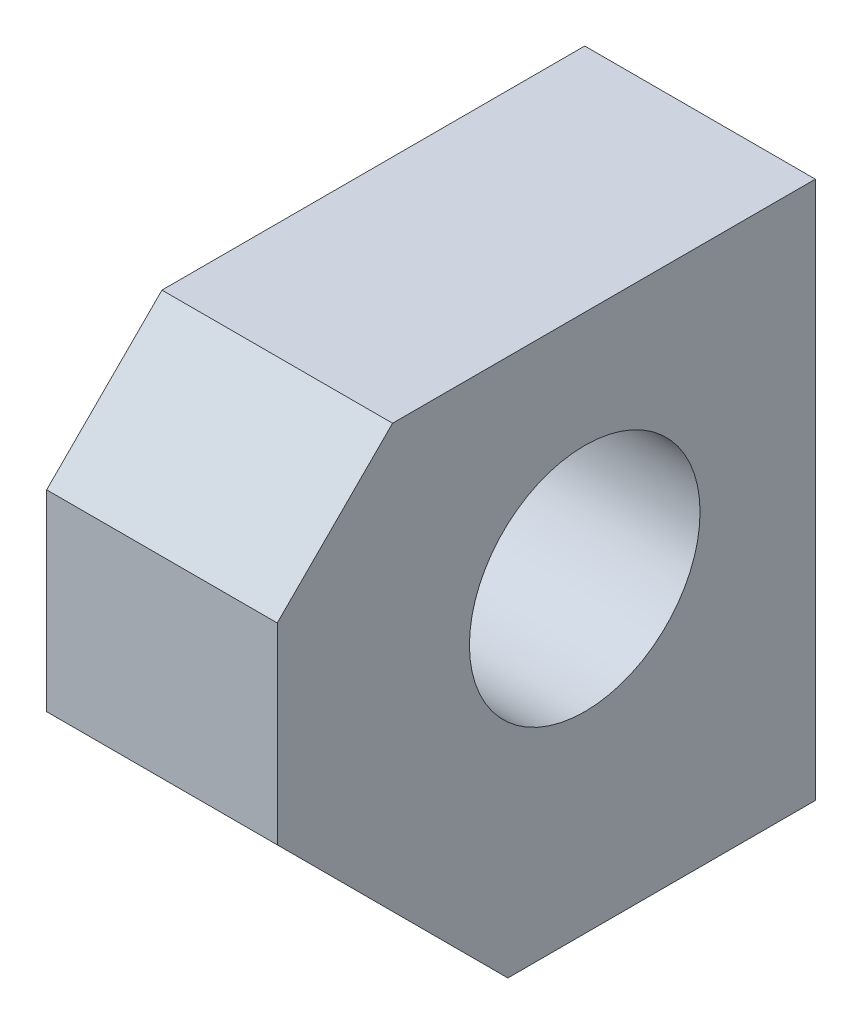
ISO-10303-21;
HEADER;
FILE_DESCRIPTION(('STEP AP214'),'2;1');
FILE_NAME('part.step','',(''),(''),'','','');
FILE_SCHEMA(('AUTOMOTIVE_DESIGN { 1 0 10303 214 1 1 1 1 }'));
ENDSEC;
DATA;
#1=APPLICATION_CONTEXT('core data for automotive mechanical design processes');
#2=APPLICATION_PROTOCOL_DEFINITION('international standard','automotive_design',2000,#1);
#3=PRODUCT_CONTEXT('',#1,'mechanical');
#4=PRODUCT('Part','Part','',(#3));
#5=PRODUCT_RELATED_PRODUCT_CATEGORY('part','',(#4));
#6=PRODUCT_DEFINITION_FORMATION('','',#4);
#7=PRODUCT_DEFINITION_CONTEXT('part definition',#1,'design');
#8=PRODUCT_DEFINITION('design','',#6,#7);
#9=PRODUCT_DEFINITION_SHAPE('','',#8);
#10=(LENGTH_UNIT() NAMED_UNIT(*) SI_UNIT(.MILLI.,.METRE.));
#11=(NAMED_UNIT(*) PLANE_ANGLE_UNIT() SI_UNIT($,.RADIAN.));
#12=(NAMED_UNIT(*) SI_UNIT($,.STERADIAN.) SOLID_ANGLE_UNIT());
#13=UNCERTAINTY_MEASURE_WITH_UNIT(LENGTH_MEASURE(1.E-05),#10,'distance_accuracy_value','');
#14=(GEOMETRIC_REPRESENTATION_CONTEXT(3) GLOBAL_UNCERTAINTY_ASSIGNED_CONTEXT((#13)) GLOBAL_UNIT_ASSIGNED_CONTEXT((#10,
#11,#12)) REPRESENTATION_CONTEXT('',''));
#15=CARTESIAN_POINT('',(0.,0.,0.));
#16=DIRECTION('',(0.,0.,1.));
#17=DIRECTION('',(1.,0.,0.));
#18=AXIS2_PLACEMENT_3D('',#15,#16,#17);
#19=CARTESIAN_POINT('',(-19.05,-412.75,1071.626));
#20=DIRECTION('',(-1.,0.,0.));
#21=DIRECTION('',(0.,0.,1.));
#22=AXIS2_PLACEMENT_3D('',#19,#20,#21);
#23=PLANE('',#22);
#24=CARTESIAN_POINT('',(-19.05,-450.85,1109.726));
#25=DIRECTION('',(1.,0.,0.));
#26=DIRECTION('',(0.,0.,-1.));
#27=AXIS2_PLACEMENT_3D('',#24,#25,#26);
#28=CIRCLE('',#27,19.05);
#29=CARTESIAN_POINT('',(-19.05,-450.85,1090.676));
#30=VERTEX_POINT('',#29);
#31=EDGE_CURVE('E19',#30,#30,#28,.T.);
#32=ORIENTED_EDGE('',*,*,#31,.T.);
#33=EDGE_LOOP('',(#32));
#34=FACE_BOUND('',#33,.T.);
#35=DIRECTION('',(0.,1.,0.));
#36=VECTOR('',#35,1.);
#37=CARTESIAN_POINT('',(-19.05,0.,1160.526));
#38=LINE('',#37,#36);
#39=CARTESIAN_POINT('',(-19.05,-431.8,1160.526));
#40=VERTEX_POINT('',#39);
#41=CARTESIAN_POINT('',(-19.05,-463.55,1160.526));
#42=VERTEX_POINT('',#41);
#43=EDGE_CURVE('E70',#40,#42,#38,.F.);
#44=ORIENTED_EDGE('',*,*,#43,.F.);
#45=DIRECTION('',(0.,-0.707106781186548,0.707106781186548));
#46=VECTOR('',#45,1.);
#47=CARTESIAN_POINT('',(-19.05,-422.275,1151.001));
#48=LINE('',#47,#46);
#49=CARTESIAN_POINT('',(-19.05,-412.75,1141.476));
#50=VERTEX_POINT('',#49);
#51=EDGE_CURVE('E104',#50,#40,#48,.T.);
#52=ORIENTED_EDGE('',*,*,#51,.F.);
#53=DIRECTION('',(0.,0.,1.));
#54=VECTOR('',#53,1.);
#55=CARTESIAN_POINT('',(-19.05,-412.75,1071.626));
#56=LINE('',#55,#54);
#57=CARTESIAN_POINT('',(-19.05,-412.75,1071.626));
#58=VERTEX_POINT('',#57);
#59=EDGE_CURVE('E100',#58,#50,#56,.T.);
#60=ORIENTED_EDGE('',*,*,#59,.F.);
#61=DIRECTION('',(0.,1.,0.));
#62=VECTOR('',#61,1.);
#63=CARTESIAN_POINT('',(-19.05,0.,1071.626));
#64=LINE('',#63,#62);
#65=CARTESIAN_POINT('',(-19.05,-501.65,1071.626));
#66=VERTEX_POINT('',#65);
#67=EDGE_CURVE('E93',#58,#66,#64,.F.);
#68=ORIENTED_EDGE('',*,*,#67,.T.);
#69=DIRECTION('',(0.,0.,-1.));
#70=VECTOR('',#69,1.);
#71=CARTESIAN_POINT('',(-19.05,-501.65,1071.626));
#72=LINE('',#71,#70);
#73=CARTESIAN_POINT('',(-19.05,-501.65,1122.426));
#74=VERTEX_POINT('',#73);
#75=EDGE_CURVE('E65',#74,#66,#72,.T.);
#76=ORIENTED_EDGE('',*,*,#75,.F.);
#77=DIRECTION('',(0.,-0.707106781186548,-0.707106781186548));
#78=VECTOR('',#77,1.);
#79=CARTESIAN_POINT('',(-19.05,-482.6,1141.476));
#80=LINE('',#79,#78);
#81=EDGE_CURVE('E80',#42,#74,#80,.T.);
#82=ORIENTED_EDGE('',*,*,#81,.F.);
#83=EDGE_LOOP('',(#44,#52,#60,#68,#76,#82));
#84=FACE_BOUND('',#83,.T.);
#85=ADVANCED_FACE('F16',(#34,#84),#23,.T.);
#86=CARTESIAN_POINT('',(0.,0.,1160.526));
#87=DIRECTION('',(0.,0.,1.));
#88=DIRECTION('',(1.,0.,0.));
#89=AXIS2_PLACEMENT_3D('',#86,#87,#88);
#90=PLANE('',#89);
#91=DIRECTION('',(0.,1.,0.));
#92=VECTOR('',#91,1.);
#93=CARTESIAN_POINT('',(19.05,-501.65,1160.526));
#94=LINE('',#93,#92);
#95=CARTESIAN_POINT('',(19.05,-431.8,1160.526));
#96=VERTEX_POINT('',#95);
#97=CARTESIAN_POINT('',(19.05,-463.55,1160.526));
#98=VERTEX_POINT('',#97);
#99=EDGE_CURVE('E106',#96,#98,#94,.F.);
#100=ORIENTED_EDGE('',*,*,#99,.F.);
#101=DIRECTION('',(1.,0.,0.));
#102=VECTOR('',#101,1.);
#103=CARTESIAN_POINT('',(0.,-431.8,1160.526));
#104=LINE('',#103,#102);
#105=EDGE_CURVE('E76',#40,#96,#104,.T.);
#106=ORIENTED_EDGE('',*,*,#105,.F.);
#107=ORIENTED_EDGE('',*,*,#43,.T.);
#108=DIRECTION('',(1.,0.,0.));
#109=VECTOR('',#108,1.);
#110=CARTESIAN_POINT('',(0.,-463.55,1160.526));
#111=LINE('',#110,#109);
#112=EDGE_CURVE('E73',#98,#42,#111,.F.);
#113=ORIENTED_EDGE('',*,*,#112,.F.);
#114=EDGE_LOOP('',(#100,#106,#107,#113));
#115=FACE_BOUND('',#114,.T.);
#116=ADVANCED_FACE('F71',(#115),#90,.T.);
#117=CARTESIAN_POINT('',(0.,-482.6,1141.476));
#118=DIRECTION('',(0.,-0.707106781186548,0.707106781186548));
#119=DIRECTION('',(0.,-0.707106781186548,-0.707106781186548));
#120=AXIS2_PLACEMENT_3D('',#117,#118,#119);
#121=PLANE('',#120);
#122=DIRECTION('',(1.,0.,0.));
#123=VECTOR('',#122,1.);
#124=CARTESIAN_POINT('',(-19.05,-501.65,1122.426));
#125=LINE('',#124,#123);
#126=CARTESIAN_POINT('',(19.05,-501.65,1122.426));
#127=VERTEX_POINT('',#126);
#128=EDGE_CURVE('E91',#127,#74,#125,.F.);
#129=ORIENTED_EDGE('',*,*,#128,.F.);
#130=DIRECTION('',(0.,-0.707106781186547,-0.707106781186548));
#131=VECTOR('',#130,1.);
#132=CARTESIAN_POINT('',(19.05,-463.55,1160.526));
#133=LINE('',#132,#131);
#134=EDGE_CURVE('E86',#98,#127,#133,.T.);
#135=ORIENTED_EDGE('',*,*,#134,.F.);
#136=ORIENTED_EDGE('',*,*,#112,.T.);
#137=ORIENTED_EDGE('',*,*,#81,.T.);
#138=EDGE_LOOP('',(#129,#135,#136,#137));
#139=FACE_BOUND('',#138,.T.);
#140=ADVANCED_FACE('F84',(#139),#121,.T.);
#141=CARTESIAN_POINT('',(-19.05,-501.65,1071.626));
#142=DIRECTION('',(0.,-1.,0.));
#143=DIRECTION('',(0.,0.,-1.));
#144=AXIS2_PLACEMENT_3D('',#141,#142,#143);
#145=PLANE('',#144);
#146=DIRECTION('',(0.,0.,-1.));
#147=VECTOR('',#146,1.);
#148=CARTESIAN_POINT('',(19.05,-501.65,1071.626));
#149=LINE('',#148,#147);
#150=CARTESIAN_POINT('',(19.05,-501.65,1071.626));
#151=VERTEX_POINT('',#150);
#152=EDGE_CURVE('E109',#127,#151,#149,.T.);
#153=ORIENTED_EDGE('',*,*,#152,.F.);
#154=ORIENTED_EDGE('',*,*,#128,.T.);
#155=ORIENTED_EDGE('',*,*,#75,.T.);
#156=DIRECTION('',(1.,0.,0.));
#157=VECTOR('',#156,1.);
#158=CARTESIAN_POINT('',(0.,-501.65,1071.626));
#159=LINE('',#158,#157);
#160=EDGE_CURVE('E95',#66,#151,#159,.T.);
#161=ORIENTED_EDGE('',*,*,#160,.T.);
#162=EDGE_LOOP('',(#153,#154,#155,#161));
#163=FACE_BOUND('',#162,.T.);
#164=ADVANCED_FACE('F131',(#163),#145,.T.);
#165=CARTESIAN_POINT('',(0.,0.,1071.626));
#166=DIRECTION('',(0.,0.,1.));
#167=DIRECTION('',(1.,0.,0.));
#168=AXIS2_PLACEMENT_3D('',#165,#166,#167);
#169=PLANE('',#168);
#170=ORIENTED_EDGE('',*,*,#160,.F.);
#171=ORIENTED_EDGE('',*,*,#67,.F.);
#172=DIRECTION('',(1.,0.,0.));
#173=VECTOR('',#172,1.);
#174=CARTESIAN_POINT('',(19.05,-412.75,1071.626));
#175=LINE('',#174,#173);
#176=CARTESIAN_POINT('',(19.05,-412.75,1071.626));
#177=VERTEX_POINT('',#176);
#178=EDGE_CURVE('E97',#177,#58,#175,.F.);
#179=ORIENTED_EDGE('',*,*,#178,.F.);
#180=DIRECTION('',(0.,1.,0.));
#181=VECTOR('',#180,1.);
#182=CARTESIAN_POINT('',(19.05,-501.65,1071.626));
#183=LINE('',#182,#181);
#184=EDGE_CURVE('E112',#151,#177,#183,.T.);
#185=ORIENTED_EDGE('',*,*,#184,.F.);
#186=EDGE_LOOP('',(#170,#171,#179,#185));
#187=FACE_BOUND('',#186,.T.);
#188=ADVANCED_FACE('F128',(#187),#169,.F.);
#189=CARTESIAN_POINT('',(19.05,-412.75,1071.626));
#190=DIRECTION('',(0.,1.,0.));
#191=DIRECTION('',(0.,0.,1.));
#192=AXIS2_PLACEMENT_3D('',#189,#190,#191);
#193=PLANE('',#192);
#194=ORIENTED_EDGE('',*,*,#59,.T.);
#195=DIRECTION('',(1.,0.,0.));
#196=VECTOR('',#195,1.);
#197=CARTESIAN_POINT('',(0.,-412.75,1141.476));
#198=LINE('',#197,#196);
#199=CARTESIAN_POINT('',(19.05,-412.75,1141.476));
#200=VERTEX_POINT('',#199);
#201=EDGE_CURVE('E33',#200,#50,#198,.F.);
#202=ORIENTED_EDGE('',*,*,#201,.F.);
#203=DIRECTION('',(0.,0.,-1.));
#204=VECTOR('',#203,1.);
#205=CARTESIAN_POINT('',(19.05,-412.75,1071.626));
#206=LINE('',#205,#204);
#207=EDGE_CURVE('E115',#177,#200,#206,.F.);
#208=ORIENTED_EDGE('',*,*,#207,.F.);
#209=ORIENTED_EDGE('',*,*,#178,.T.);
#210=EDGE_LOOP('',(#194,#202,#208,#209));
#211=FACE_BOUND('',#210,.T.);
#212=ADVANCED_FACE('F124',(#211),#193,.T.);
#213=CARTESIAN_POINT('',(0.,-422.275,1151.001));
#214=DIRECTION('',(0.,0.707106781186548,0.707106781186548));
#215=DIRECTION('',(0.,-0.707106781186548,0.707106781186548));
#216=AXIS2_PLACEMENT_3D('',#213,#214,#215);
#217=PLANE('',#216);
#218=ORIENTED_EDGE('',*,*,#201,.T.);
#219=ORIENTED_EDGE('',*,*,#51,.T.);
#220=ORIENTED_EDGE('',*,*,#105,.T.);
#221=DIRECTION('',(0.,-0.707106781186546,0.707106781186548));
#222=VECTOR('',#221,1.);
#223=CARTESIAN_POINT('',(19.05,-412.75,1141.476));
#224=LINE('',#223,#222);
#225=EDGE_CURVE('E25',#200,#96,#224,.T.);
#226=ORIENTED_EDGE('',*,*,#225,.F.);
#227=EDGE_LOOP('',(#218,#219,#220,#226));
#228=FACE_BOUND('',#227,.T.);
#229=ADVANCED_FACE('F122',(#228),#217,.T.);
#230=CARTESIAN_POINT('',(-533.4,-450.85,1109.726));
#231=DIRECTION('',(1.,0.,0.));
#232=DIRECTION('',(0.,0.,-1.));
#233=AXIS2_PLACEMENT_3D('',#230,#231,#232);
#234=CYLINDRICAL_SURFACE('',#233,19.05);
#235=CARTESIAN_POINT('',(19.05,-450.85,1109.726));
#236=DIRECTION('',(1.,0.,0.));
#237=DIRECTION('',(0.,0.,-1.));
#238=AXIS2_PLACEMENT_3D('',#235,#236,#237);
#239=CIRCLE('',#238,19.05);
#240=CARTESIAN_POINT('',(19.05,-450.85,1090.676));
#241=VERTEX_POINT('',#240);
#242=EDGE_CURVE('E11',#241,#241,#239,.F.);
#243=ORIENTED_EDGE('',*,*,#242,.F.);
#244=EDGE_LOOP('',(#243));
#245=FACE_BOUND('',#244,.T.);
#246=ORIENTED_EDGE('',*,*,#31,.F.);
#247=EDGE_LOOP('',(#246));
#248=FACE_BOUND('',#247,.T.);
#249=ADVANCED_FACE('F142',(#245,#248),#234,.F.);
#250=CARTESIAN_POINT('',(19.05,-501.65,1071.626));
#251=DIRECTION('',(1.,0.,0.));
#252=DIRECTION('',(0.,0.,-1.));
#253=AXIS2_PLACEMENT_3D('',#250,#251,#252);
#254=PLANE('',#253);
#255=ORIENTED_EDGE('',*,*,#242,.T.);
#256=EDGE_LOOP('',(#255));
#257=FACE_BOUND('',#256,.T.);
#258=ORIENTED_EDGE('',*,*,#207,.T.);
#259=ORIENTED_EDGE('',*,*,#225,.T.);
#260=ORIENTED_EDGE('',*,*,#99,.T.);
#261=ORIENTED_EDGE('',*,*,#134,.T.);
#262=ORIENTED_EDGE('',*,*,#152,.T.);
#263=ORIENTED_EDGE('',*,*,#184,.T.);
#264=EDGE_LOOP('',(#258,#259,#260,#261,#262,#263));
#265=FACE_BOUND('',#264,.T.);
#266=ADVANCED_FACE('F120',(#257,#265),#254,.T.);
#267=CLOSED_SHELL('',(#85,#116,#140,#164,#188,#212,#229,#249,#266));
#268=MANIFOLD_SOLID_BREP('B1',#267);
#269=ADVANCED_BREP_SHAPE_REPRESENTATION('',(#18,#268),#14);
#270=SHAPE_DEFINITION_REPRESENTATION(#9,#269);
ENDSEC;
END-ISO-10303-21;
